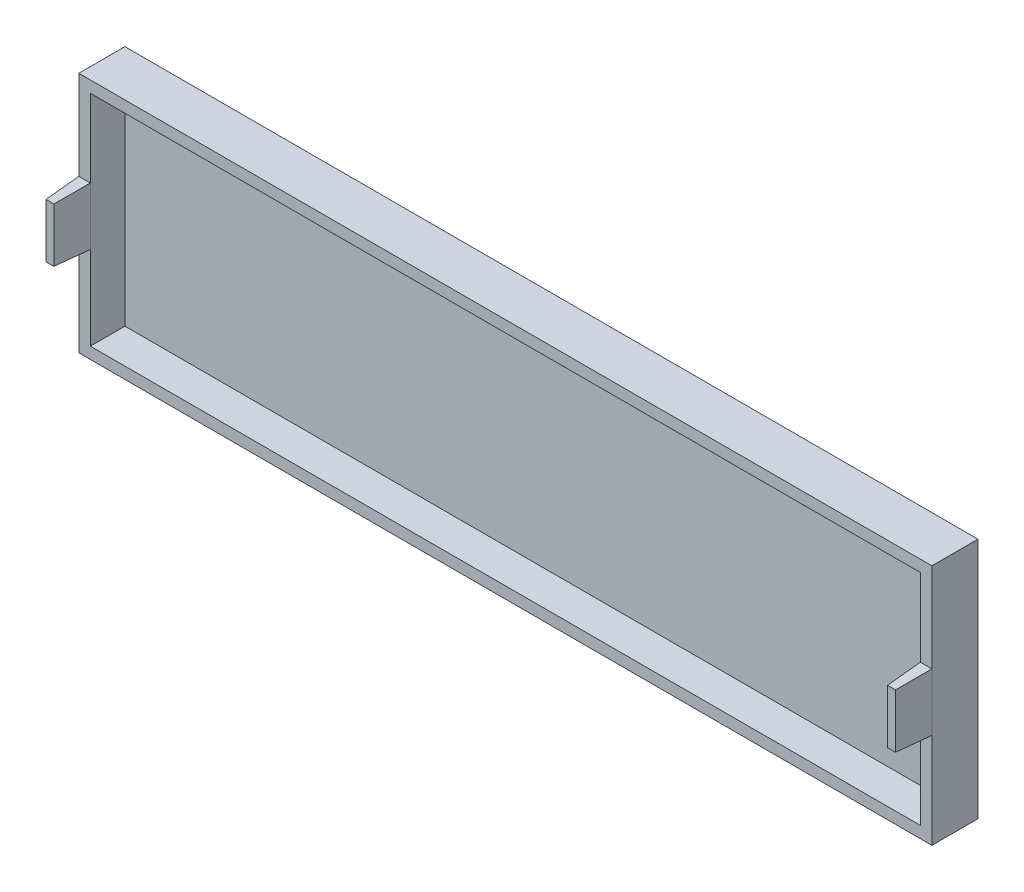
ISO-10303-21;
HEADER;
FILE_DESCRIPTION(('STEP AP214'),'2;1');
FILE_NAME('part.step','',(''),(''),'','','');
FILE_SCHEMA(('AUTOMOTIVE_DESIGN { 1 0 10303 214 1 1 1 1 }'));
ENDSEC;
DATA;
#1=APPLICATION_CONTEXT('core data for automotive mechanical design processes');
#2=APPLICATION_PROTOCOL_DEFINITION('international standard','automotive_design',2000,#1);
#3=PRODUCT_CONTEXT('',#1,'mechanical');
#4=PRODUCT('Part','Part','',(#3));
#5=PRODUCT_RELATED_PRODUCT_CATEGORY('part','',(#4));
#6=PRODUCT_DEFINITION_FORMATION('','',#4);
#7=PRODUCT_DEFINITION_CONTEXT('part definition',#1,'design');
#8=PRODUCT_DEFINITION('design','',#6,#7);
#9=PRODUCT_DEFINITION_SHAPE('','',#8);
#10=(LENGTH_UNIT() NAMED_UNIT(*) SI_UNIT(.MILLI.,.METRE.));
#11=(NAMED_UNIT(*) PLANE_ANGLE_UNIT() SI_UNIT($,.RADIAN.));
#12=(NAMED_UNIT(*) SI_UNIT($,.STERADIAN.) SOLID_ANGLE_UNIT());
#13=UNCERTAINTY_MEASURE_WITH_UNIT(LENGTH_MEASURE(1.E-05),#10,'distance_accuracy_value','');
#14=(GEOMETRIC_REPRESENTATION_CONTEXT(3) GLOBAL_UNCERTAINTY_ASSIGNED_CONTEXT((#13)) GLOBAL_UNIT_ASSIGNED_CONTEXT((#10,
#11,#12)) REPRESENTATION_CONTEXT('',''));
#15=CARTESIAN_POINT('',(0.,0.,0.));
#16=DIRECTION('',(0.,0.,1.));
#17=DIRECTION('',(1.,0.,0.));
#18=AXIS2_PLACEMENT_3D('',#15,#16,#17);
#19=CARTESIAN_POINT('',(0.,0.,8.));
#20=DIRECTION('',(0.,0.,1.));
#21=DIRECTION('',(1.,0.,0.));
#22=AXIS2_PLACEMENT_3D('',#19,#20,#21);
#23=PLANE('',#22);
#24=DIRECTION('',(1.,0.,0.));
#25=VECTOR('',#24,1.);
#26=CARTESIAN_POINT('',(74.,5.51539286145829,8.));
#27=LINE('',#26,#25);
#28=CARTESIAN_POINT('',(72.,5.51539286145829,8.));
#29=VERTEX_POINT('',#28);
#30=CARTESIAN_POINT('',(74.,5.51539286145829,8.));
#31=VERTEX_POINT('',#30);
#32=EDGE_CURVE('E49',#29,#31,#27,.T.);
#33=ORIENTED_EDGE('',*,*,#32,.T.);
#34=DIRECTION('',(0.,1.,0.));
#35=VECTOR('',#34,1.);
#36=CARTESIAN_POINT('',(74.,-21.,8.));
#37=LINE('',#36,#35);
#38=CARTESIAN_POINT('',(74.,21.,8.));
#39=VERTEX_POINT('',#38);
#40=EDGE_CURVE('E226',#31,#39,#37,.T.);
#41=ORIENTED_EDGE('',*,*,#40,.T.);
#42=DIRECTION('',(-1.,0.,0.));
#43=VECTOR('',#42,1.);
#44=CARTESIAN_POINT('',(74.,21.,8.));
#45=LINE('',#44,#43);
#46=CARTESIAN_POINT('',(-74.,21.,8.));
#47=VERTEX_POINT('',#46);
#48=EDGE_CURVE('E218',#39,#47,#45,.T.);
#49=ORIENTED_EDGE('',*,*,#48,.T.);
#50=DIRECTION('',(0.,-1.,0.));
#51=VECTOR('',#50,1.);
#52=CARTESIAN_POINT('',(-74.,21.,8.));
#53=LINE('',#52,#51);
#54=CARTESIAN_POINT('',(-74.,5.5153928614583,8.));
#55=VERTEX_POINT('',#54);
#56=EDGE_CURVE('E222',#47,#55,#53,.T.);
#57=ORIENTED_EDGE('',*,*,#56,.T.);
#58=DIRECTION('',(-1.,0.,0.));
#59=VECTOR('',#58,1.);
#60=CARTESIAN_POINT('',(-74.,5.51539286145829,8.));
#61=LINE('',#60,#59);
#62=CARTESIAN_POINT('',(-72.,5.51539286145829,8.));
#63=VERTEX_POINT('',#62);
#64=EDGE_CURVE('E57',#63,#55,#61,.T.);
#65=ORIENTED_EDGE('',*,*,#64,.F.);
#66=DIRECTION('',(0.,-1.,0.));
#67=VECTOR('',#66,1.);
#68=CARTESIAN_POINT('',(-72.,19.,8.));
#69=LINE('',#68,#67);
#70=CARTESIAN_POINT('',(-72.,19.,8.));
#71=VERTEX_POINT('',#70);
#72=EDGE_CURVE('E196',#71,#63,#69,.T.);
#73=ORIENTED_EDGE('',*,*,#72,.F.);
#74=DIRECTION('',(-1.,0.,0.));
#75=VECTOR('',#74,1.);
#76=CARTESIAN_POINT('',(72.,19.,8.));
#77=LINE('',#76,#75);
#78=CARTESIAN_POINT('',(72.,19.,8.));
#79=VERTEX_POINT('',#78);
#80=EDGE_CURVE('E186',#79,#71,#77,.T.);
#81=ORIENTED_EDGE('',*,*,#80,.F.);
#82=DIRECTION('',(0.,1.,0.));
#83=VECTOR('',#82,1.);
#84=CARTESIAN_POINT('',(72.,-19.,8.));
#85=LINE('',#84,#83);
#86=EDGE_CURVE('E187',#29,#79,#85,.T.);
#87=ORIENTED_EDGE('',*,*,#86,.F.);
#88=EDGE_LOOP('',(#33,#41,#49,#57,#65,#73,#81,#87));
#89=FACE_BOUND('',#88,.T.);
#90=ADVANCED_FACE('F34',(#89),#23,.T.);
#91=CARTESIAN_POINT('',(-74.,-21.,2.));
#92=DIRECTION('',(1.,0.,0.));
#93=DIRECTION('',(0.,0.,-1.));
#94=AXIS2_PLACEMENT_3D('',#91,#92,#93);
#95=PLANE('',#94);
#96=DIRECTION('',(0.,-1.,0.));
#97=VECTOR('',#96,1.);
#98=CARTESIAN_POINT('',(-74.,-21.,0.));
#99=LINE('',#98,#97);
#100=CARTESIAN_POINT('',(-74.,21.,0.));
#101=VERTEX_POINT('',#100);
#102=CARTESIAN_POINT('',(-74.,-21.,0.));
#103=VERTEX_POINT('',#102);
#104=EDGE_CURVE('E228',#101,#103,#99,.T.);
#105=ORIENTED_EDGE('',*,*,#104,.T.);
#106=DIRECTION('',(0.,0.,-1.));
#107=VECTOR('',#106,1.);
#108=CARTESIAN_POINT('',(-74.,-21.,2.));
#109=LINE('',#108,#107);
#110=CARTESIAN_POINT('',(-74.,-21.,8.));
#111=VERTEX_POINT('',#110);
#112=EDGE_CURVE('E11',#111,#103,#109,.T.);
#113=ORIENTED_EDGE('',*,*,#112,.F.);
#114=CARTESIAN_POINT('',(-74.,-4.4846071385417,8.));
#115=VERTEX_POINT('',#114);
#116=EDGE_CURVE('E221',#115,#111,#53,.T.);
#117=ORIENTED_EDGE('',*,*,#116,.F.);
#118=DIRECTION('',(0.,-1.,0.));
#119=VECTOR('',#118,1.);
#120=CARTESIAN_POINT('',(-74.,-4.48460713854171,8.));
#121=LINE('',#120,#119);
#122=EDGE_CURVE('E261',#55,#115,#121,.T.);
#123=ORIENTED_EDGE('',*,*,#122,.F.);
#124=ORIENTED_EDGE('',*,*,#56,.F.);
#125=DIRECTION('',(0.,0.,-1.));
#126=VECTOR('',#125,1.);
#127=CARTESIAN_POINT('',(-74.,21.,2.));
#128=LINE('',#127,#126);
#129=EDGE_CURVE('E237',#47,#101,#128,.T.);
#130=ORIENTED_EDGE('',*,*,#129,.T.);
#131=EDGE_LOOP('',(#105,#113,#117,#123,#124,#130));
#132=FACE_BOUND('',#131,.T.);
#133=ADVANCED_FACE('F36',(#132),#95,.F.);
#134=CARTESIAN_POINT('',(74.,-21.,2.));
#135=DIRECTION('',(0.,1.,0.));
#136=DIRECTION('',(-1.,0.,0.));
#137=AXIS2_PLACEMENT_3D('',#134,#135,#136);
#138=PLANE('',#137);
#139=DIRECTION('',(1.,0.,0.));
#140=VECTOR('',#139,1.);
#141=CARTESIAN_POINT('',(74.,-21.,0.));
#142=LINE('',#141,#140);
#143=CARTESIAN_POINT('',(74.,-21.,0.));
#144=VERTEX_POINT('',#143);
#145=EDGE_CURVE('E231',#103,#144,#142,.T.);
#146=ORIENTED_EDGE('',*,*,#145,.T.);
#147=DIRECTION('',(0.,0.,-1.));
#148=VECTOR('',#147,1.);
#149=CARTESIAN_POINT('',(74.,-21.,2.));
#150=LINE('',#149,#148);
#151=CARTESIAN_POINT('',(74.,-21.,8.));
#152=VERTEX_POINT('',#151);
#153=EDGE_CURVE('E42',#152,#144,#150,.T.);
#154=ORIENTED_EDGE('',*,*,#153,.F.);
#155=DIRECTION('',(1.,0.,0.));
#156=VECTOR('',#155,1.);
#157=CARTESIAN_POINT('',(-74.,-21.,8.));
#158=LINE('',#157,#156);
#159=EDGE_CURVE('E224',#111,#152,#158,.T.);
#160=ORIENTED_EDGE('',*,*,#159,.F.);
#161=ORIENTED_EDGE('',*,*,#112,.T.);
#162=EDGE_LOOP('',(#146,#154,#160,#161));
#163=FACE_BOUND('',#162,.T.);
#164=ADVANCED_FACE('F322',(#163),#138,.F.);
#165=CARTESIAN_POINT('',(74.,-21.,2.));
#166=DIRECTION('',(-1.,0.,0.));
#167=DIRECTION('',(0.,0.,1.));
#168=AXIS2_PLACEMENT_3D('',#165,#166,#167);
#169=PLANE('',#168);
#170=DIRECTION('',(0.,1.,0.));
#171=VECTOR('',#170,1.);
#172=CARTESIAN_POINT('',(74.,-21.,0.));
#173=LINE('',#172,#171);
#174=CARTESIAN_POINT('',(74.,21.,0.));
#175=VERTEX_POINT('',#174);
#176=EDGE_CURVE('E233',#144,#175,#173,.T.);
#177=ORIENTED_EDGE('',*,*,#176,.T.);
#178=DIRECTION('',(0.,0.,-1.));
#179=VECTOR('',#178,1.);
#180=CARTESIAN_POINT('',(74.,21.,2.));
#181=LINE('',#180,#179);
#182=EDGE_CURVE('E240',#39,#175,#181,.T.);
#183=ORIENTED_EDGE('',*,*,#182,.F.);
#184=ORIENTED_EDGE('',*,*,#40,.F.);
#185=DIRECTION('',(0.,-1.,0.));
#186=VECTOR('',#185,1.);
#187=CARTESIAN_POINT('',(74.,-4.48460713854171,8.));
#188=LINE('',#187,#186);
#189=CARTESIAN_POINT('',(74.,-4.48460713854171,8.));
#190=VERTEX_POINT('',#189);
#191=EDGE_CURVE('E179',#31,#190,#188,.T.);
#192=ORIENTED_EDGE('',*,*,#191,.T.);
#193=EDGE_CURVE('E178',#152,#190,#37,.T.);
#194=ORIENTED_EDGE('',*,*,#193,.F.);
#195=ORIENTED_EDGE('',*,*,#153,.T.);
#196=EDGE_LOOP('',(#177,#183,#184,#192,#194,#195));
#197=FACE_BOUND('',#196,.T.);
#198=ADVANCED_FACE('F245',(#197),#169,.F.);
#199=CARTESIAN_POINT('',(74.,21.,2.));
#200=DIRECTION('',(0.,-1.,0.));
#201=DIRECTION('',(1.,0.,0.));
#202=AXIS2_PLACEMENT_3D('',#199,#200,#201);
#203=PLANE('',#202);
#204=DIRECTION('',(-1.,0.,0.));
#205=VECTOR('',#204,1.);
#206=CARTESIAN_POINT('',(74.,21.,0.));
#207=LINE('',#206,#205);
#208=EDGE_CURVE('E235',#175,#101,#207,.T.);
#209=ORIENTED_EDGE('',*,*,#208,.T.);
#210=ORIENTED_EDGE('',*,*,#129,.F.);
#211=ORIENTED_EDGE('',*,*,#48,.F.);
#212=ORIENTED_EDGE('',*,*,#182,.T.);
#213=EDGE_LOOP('',(#209,#210,#211,#212));
#214=FACE_BOUND('',#213,.T.);
#215=ADVANCED_FACE('F254',(#214),#203,.F.);
#216=CARTESIAN_POINT('',(0.,0.,0.));
#217=DIRECTION('',(0.,0.,1.));
#218=DIRECTION('',(1.,0.,0.));
#219=AXIS2_PLACEMENT_3D('',#216,#217,#218);
#220=PLANE('',#219);
#221=ORIENTED_EDGE('',*,*,#104,.F.);
#222=ORIENTED_EDGE('',*,*,#208,.F.);
#223=ORIENTED_EDGE('',*,*,#176,.F.);
#224=ORIENTED_EDGE('',*,*,#145,.F.);
#225=EDGE_LOOP('',(#221,#222,#223,#224));
#226=FACE_BOUND('',#225,.T.);
#227=ADVANCED_FACE('F252',(#226),#220,.F.);
#228=DIRECTION('',(-1.,0.,0.));
#229=VECTOR('',#228,1.);
#230=CARTESIAN_POINT('',(72.,-4.48460713854171,8.));
#231=LINE('',#230,#229);
#232=CARTESIAN_POINT('',(72.,-4.48460713854171,8.));
#233=VERTEX_POINT('',#232);
#234=EDGE_CURVE('E153',#190,#233,#231,.T.);
#235=ORIENTED_EDGE('',*,*,#234,.T.);
#236=CARTESIAN_POINT('',(72.,-19.,8.));
#237=VERTEX_POINT('',#236);
#238=EDGE_CURVE('E175',#237,#233,#85,.T.);
#239=ORIENTED_EDGE('',*,*,#238,.F.);
#240=DIRECTION('',(1.,0.,0.));
#241=VECTOR('',#240,1.);
#242=CARTESIAN_POINT('',(-72.,-19.,8.));
#243=LINE('',#242,#241);
#244=CARTESIAN_POINT('',(-72.,-19.,8.));
#245=VERTEX_POINT('',#244);
#246=EDGE_CURVE('E198',#245,#237,#243,.T.);
#247=ORIENTED_EDGE('',*,*,#246,.F.);
#248=CARTESIAN_POINT('',(-72.,-4.48460713854171,8.));
#249=VERTEX_POINT('',#248);
#250=EDGE_CURVE('E189',#249,#245,#69,.T.);
#251=ORIENTED_EDGE('',*,*,#250,.F.);
#252=DIRECTION('',(1.,0.,0.));
#253=VECTOR('',#252,1.);
#254=CARTESIAN_POINT('',(-72.,-4.48460713854171,8.));
#255=LINE('',#254,#253);
#256=EDGE_CURVE('E283',#115,#249,#255,.T.);
#257=ORIENTED_EDGE('',*,*,#256,.F.);
#258=ORIENTED_EDGE('',*,*,#116,.T.);
#259=ORIENTED_EDGE('',*,*,#159,.T.);
#260=ORIENTED_EDGE('',*,*,#193,.T.);
#261=EDGE_LOOP('',(#235,#239,#247,#251,#257,#258,#259,#260));
#262=FACE_BOUND('',#261,.T.);
#263=ADVANCED_FACE('F173',(#262),#23,.T.);
#264=CARTESIAN_POINT('',(72.,-19.,8.));
#265=DIRECTION('',(-1.,0.,0.));
#266=DIRECTION('',(0.,0.,1.));
#267=AXIS2_PLACEMENT_3D('',#264,#265,#266);
#268=PLANE('',#267);
#269=DIRECTION('',(0.,1.,0.));
#270=VECTOR('',#269,1.);
#271=CARTESIAN_POINT('',(72.,-19.,2.));
#272=LINE('',#271,#270);
#273=CARTESIAN_POINT('',(72.,-19.,2.));
#274=VERTEX_POINT('',#273);
#275=CARTESIAN_POINT('',(72.,19.,2.));
#276=VERTEX_POINT('',#275);
#277=EDGE_CURVE('E200',#274,#276,#272,.T.);
#278=ORIENTED_EDGE('',*,*,#277,.F.);
#279=DIRECTION('',(0.,0.,-1.));
#280=VECTOR('',#279,1.);
#281=CARTESIAN_POINT('',(72.,-19.,8.));
#282=LINE('',#281,#280);
#283=EDGE_CURVE('E185',#237,#274,#282,.T.);
#284=ORIENTED_EDGE('',*,*,#283,.F.);
#285=ORIENTED_EDGE('',*,*,#238,.T.);
#286=DIRECTION('',(0.,1.,0.));
#287=VECTOR('',#286,1.);
#288=CARTESIAN_POINT('',(72.,5.51539286145829,8.));
#289=LINE('',#288,#287);
#290=EDGE_CURVE('E164',#233,#29,#289,.T.);
#291=ORIENTED_EDGE('',*,*,#290,.T.);
#292=ORIENTED_EDGE('',*,*,#86,.T.);
#293=DIRECTION('',(0.,0.,-1.));
#294=VECTOR('',#293,1.);
#295=CARTESIAN_POINT('',(72.,19.,8.));
#296=LINE('',#295,#294);
#297=EDGE_CURVE('E215',#79,#276,#296,.T.);
#298=ORIENTED_EDGE('',*,*,#297,.T.);
#299=EDGE_LOOP('',(#278,#284,#285,#291,#292,#298));
#300=FACE_BOUND('',#299,.T.);
#301=ADVANCED_FACE('F183',(#300),#268,.T.);
#302=CARTESIAN_POINT('',(72.,19.,8.));
#303=DIRECTION('',(0.,-1.,0.));
#304=DIRECTION('',(0.,0.,-1.));
#305=AXIS2_PLACEMENT_3D('',#302,#303,#304);
#306=PLANE('',#305);
#307=DIRECTION('',(-1.,0.,0.));
#308=VECTOR('',#307,1.);
#309=CARTESIAN_POINT('',(72.,19.,2.));
#310=LINE('',#309,#308);
#311=CARTESIAN_POINT('',(-72.,19.,2.));
#312=VERTEX_POINT('',#311);
#313=EDGE_CURVE('E202',#276,#312,#310,.T.);
#314=ORIENTED_EDGE('',*,*,#313,.F.);
#315=ORIENTED_EDGE('',*,*,#297,.F.);
#316=ORIENTED_EDGE('',*,*,#80,.T.);
#317=DIRECTION('',(0.,0.,-1.));
#318=VECTOR('',#317,1.);
#319=CARTESIAN_POINT('',(-72.,19.,8.));
#320=LINE('',#319,#318);
#321=EDGE_CURVE('E212',#71,#312,#320,.T.);
#322=ORIENTED_EDGE('',*,*,#321,.T.);
#323=EDGE_LOOP('',(#314,#315,#316,#322));
#324=FACE_BOUND('',#323,.T.);
#325=ADVANCED_FACE('F340',(#324),#306,.T.);
#326=CARTESIAN_POINT('',(-72.,19.,8.));
#327=DIRECTION('',(1.,0.,0.));
#328=DIRECTION('',(0.,0.,-1.));
#329=AXIS2_PLACEMENT_3D('',#326,#327,#328);
#330=PLANE('',#329);
#331=DIRECTION('',(0.,-1.,0.));
#332=VECTOR('',#331,1.);
#333=CARTESIAN_POINT('',(-72.,19.,2.));
#334=LINE('',#333,#332);
#335=CARTESIAN_POINT('',(-72.,-19.,2.));
#336=VERTEX_POINT('',#335);
#337=EDGE_CURVE('E205',#312,#336,#334,.T.);
#338=ORIENTED_EDGE('',*,*,#337,.F.);
#339=ORIENTED_EDGE('',*,*,#321,.F.);
#340=ORIENTED_EDGE('',*,*,#72,.T.);
#341=DIRECTION('',(0.,1.,0.));
#342=VECTOR('',#341,1.);
#343=CARTESIAN_POINT('',(-72.,5.51539286145829,8.));
#344=LINE('',#343,#342);
#345=EDGE_CURVE('E286',#249,#63,#344,.T.);
#346=ORIENTED_EDGE('',*,*,#345,.F.);
#347=ORIENTED_EDGE('',*,*,#250,.T.);
#348=DIRECTION('',(0.,0.,-1.));
#349=VECTOR('',#348,1.);
#350=CARTESIAN_POINT('',(-72.,-19.,8.));
#351=LINE('',#350,#349);
#352=EDGE_CURVE('E209',#245,#336,#351,.T.);
#353=ORIENTED_EDGE('',*,*,#352,.T.);
#354=EDGE_LOOP('',(#338,#339,#340,#346,#347,#353));
#355=FACE_BOUND('',#354,.T.);
#356=ADVANCED_FACE('F355',(#355),#330,.T.);
#357=CARTESIAN_POINT('',(-72.,-19.,8.));
#358=DIRECTION('',(0.,1.,0.));
#359=DIRECTION('',(0.,0.,1.));
#360=AXIS2_PLACEMENT_3D('',#357,#358,#359);
#361=PLANE('',#360);
#362=DIRECTION('',(1.,0.,0.));
#363=VECTOR('',#362,1.);
#364=CARTESIAN_POINT('',(-72.,-19.,2.));
#365=LINE('',#364,#363);
#366=EDGE_CURVE('E191',#336,#274,#365,.T.);
#367=ORIENTED_EDGE('',*,*,#366,.F.);
#368=ORIENTED_EDGE('',*,*,#352,.F.);
#369=ORIENTED_EDGE('',*,*,#246,.T.);
#370=ORIENTED_EDGE('',*,*,#283,.T.);
#371=EDGE_LOOP('',(#367,#368,#369,#370));
#372=FACE_BOUND('',#371,.T.);
#373=ADVANCED_FACE('F348',(#372),#361,.T.);
#374=CARTESIAN_POINT('',(0.,0.,2.));
#375=DIRECTION('',(0.,0.,1.));
#376=DIRECTION('',(1.,0.,0.));
#377=AXIS2_PLACEMENT_3D('',#374,#375,#376);
#378=PLANE('',#377);
#379=ORIENTED_EDGE('',*,*,#277,.T.);
#380=ORIENTED_EDGE('',*,*,#313,.T.);
#381=ORIENTED_EDGE('',*,*,#337,.T.);
#382=ORIENTED_EDGE('',*,*,#366,.T.);
#383=EDGE_LOOP('',(#379,#380,#381,#382));
#384=FACE_BOUND('',#383,.T.);
#385=ADVANCED_FACE('F346',(#384),#378,.T.);
#386=CARTESIAN_POINT('',(-74.,5.51539286145829,8.));
#387=DIRECTION('',(0.,0.998629534754574,0.0523359562429439));
#388=DIRECTION('',(0.,-0.0523359562429439,0.998629534754574));
#389=AXIS2_PLACEMENT_3D('',#386,#387,#388);
#390=PLANE('',#389);
#391=ORIENTED_EDGE('',*,*,#64,.T.);
#392=DIRECTION('',(-0.052264427688714,0.052264427688714,-0.997264688634237));
#393=VECTOR('',#392,1.);
#394=CARTESIAN_POINT('',(-73.9726842959837,5.488077157442,8.52121468205632));
#395=LINE('',#394,#393);
#396=CARTESIAN_POINT('',(-73.6855533243018,5.20094618576005,14.));
#397=VERTEX_POINT('',#396);
#398=EDGE_CURVE('E203',#397,#55,#395,.T.);
#399=ORIENTED_EDGE('',*,*,#398,.F.);
#400=DIRECTION('',(1.,0.,0.));
#401=VECTOR('',#400,1.);
#402=CARTESIAN_POINT('',(0.,5.20094618576005,14.));
#403=LINE('',#402,#401);
#404=CARTESIAN_POINT('',(-72.3144466756982,5.20094618576005,14.));
#405=VERTEX_POINT('',#404);
#406=EDGE_CURVE('E289',#405,#397,#403,.F.);
#407=ORIENTED_EDGE('',*,*,#406,.F.);
#408=DIRECTION('',(0.052264427688714,0.052264427688714,-0.997264688634237));
#409=VECTOR('',#408,1.);
#410=CARTESIAN_POINT('',(-72.0054631408032,5.50992972065504,8.10424293641126));
#411=LINE('',#410,#409);
#412=EDGE_CURVE('E292',#405,#63,#411,.T.);
#413=ORIENTED_EDGE('',*,*,#412,.T.);
#414=EDGE_LOOP('',(#391,#399,#407,#413));
#415=FACE_BOUND('',#414,.T.);
#416=ADVANCED_FACE('F315',(#415),#390,.T.);
#417=CARTESIAN_POINT('',(-74.,-4.48460713854171,8.));
#418=DIRECTION('',(-0.998629534754574,0.,0.0523359562429439));
#419=DIRECTION('',(0.0523359562429439,0.,0.998629534754574));
#420=AXIS2_PLACEMENT_3D('',#417,#418,#419);
#421=PLANE('',#420);
#422=ORIENTED_EDGE('',*,*,#122,.T.);
#423=DIRECTION('',(-0.052264427688714,-0.0522644276887139,-0.997264688634237));
#424=VECTOR('',#423,1.);
#425=CARTESIAN_POINT('',(-73.9945368591967,-4.47914399773845,8.10424293641126));
#426=LINE('',#425,#424);
#427=CARTESIAN_POINT('',(-73.6855533243018,-4.17016046284346,14.));
#428=VERTEX_POINT('',#427);
#429=EDGE_CURVE('E291',#428,#115,#426,.T.);
#430=ORIENTED_EDGE('',*,*,#429,.F.);
#431=DIRECTION('',(0.,1.,0.));
#432=VECTOR('',#431,1.);
#433=CARTESIAN_POINT('',(-73.6855533243017,0.,14.));
#434=LINE('',#433,#432);
#435=EDGE_CURVE('E302',#397,#428,#434,.F.);
#436=ORIENTED_EDGE('',*,*,#435,.F.);
#437=ORIENTED_EDGE('',*,*,#398,.T.);
#438=EDGE_LOOP('',(#422,#430,#436,#437));
#439=FACE_BOUND('',#438,.T.);
#440=ADVANCED_FACE('F317',(#439),#421,.T.);
#441=CARTESIAN_POINT('',(-72.,-4.48460713854171,8.));
#442=DIRECTION('',(0.,-0.998629534754574,0.0523359562429439));
#443=DIRECTION('',(0.,-0.0523359562429439,-0.998629534754574));
#444=AXIS2_PLACEMENT_3D('',#441,#442,#443);
#445=PLANE('',#444);
#446=ORIENTED_EDGE('',*,*,#256,.T.);
#447=DIRECTION('',(0.052264427688714,-0.052264427688714,-0.997264688634237));
#448=VECTOR('',#447,1.);
#449=CARTESIAN_POINT('',(-72.0273157040163,-4.45729143452542,8.52121468205632));
#450=LINE('',#449,#448);
#451=CARTESIAN_POINT('',(-72.3144466756982,-4.17016046284346,14.));
#452=VERTEX_POINT('',#451);
#453=EDGE_CURVE('E295',#452,#249,#450,.T.);
#454=ORIENTED_EDGE('',*,*,#453,.F.);
#455=DIRECTION('',(-1.,0.,0.));
#456=VECTOR('',#455,1.);
#457=CARTESIAN_POINT('',(0.,-4.17016046284349,14.));
#458=LINE('',#457,#456);
#459=EDGE_CURVE('E303',#428,#452,#458,.F.);
#460=ORIENTED_EDGE('',*,*,#459,.F.);
#461=ORIENTED_EDGE('',*,*,#429,.T.);
#462=EDGE_LOOP('',(#446,#454,#460,#461));
#463=FACE_BOUND('',#462,.T.);
#464=ADVANCED_FACE('F320',(#463),#445,.T.);
#465=CARTESIAN_POINT('',(-72.,5.51539286145829,8.));
#466=DIRECTION('',(0.998629534754574,0.,0.0523359562429439));
#467=DIRECTION('',(0.0523359562429439,0.,-0.998629534754574));
#468=AXIS2_PLACEMENT_3D('',#465,#466,#467);
#469=PLANE('',#468);
#470=ORIENTED_EDGE('',*,*,#345,.T.);
#471=ORIENTED_EDGE('',*,*,#412,.F.);
#472=DIRECTION('',(0.,-1.,0.));
#473=VECTOR('',#472,1.);
#474=CARTESIAN_POINT('',(-72.3144466756982,0.,14.));
#475=LINE('',#474,#473);
#476=EDGE_CURVE('E193',#452,#405,#475,.F.);
#477=ORIENTED_EDGE('',*,*,#476,.F.);
#478=ORIENTED_EDGE('',*,*,#453,.T.);
#479=EDGE_LOOP('',(#470,#471,#477,#478));
#480=FACE_BOUND('',#479,.T.);
#481=ADVANCED_FACE('F313',(#480),#469,.T.);
#482=CARTESIAN_POINT('',(0.,0.,14.));
#483=DIRECTION('',(0.,0.,-1.));
#484=DIRECTION('',(-1.,0.,0.));
#485=AXIS2_PLACEMENT_3D('',#482,#483,#484);
#486=PLANE('',#485);
#487=ORIENTED_EDGE('',*,*,#406,.T.);
#488=ORIENTED_EDGE('',*,*,#435,.T.);
#489=ORIENTED_EDGE('',*,*,#459,.T.);
#490=ORIENTED_EDGE('',*,*,#476,.T.);
#491=EDGE_LOOP('',(#487,#488,#489,#490));
#492=FACE_BOUND('',#491,.T.);
#493=ADVANCED_FACE('F309',(#492),#486,.F.);
#494=CARTESIAN_POINT('',(74.,5.51539286145829,8.));
#495=DIRECTION('',(0.,0.998629534754574,0.0523359562429439));
#496=DIRECTION('',(0.,-0.0523359562429439,0.998629534754574));
#497=AXIS2_PLACEMENT_3D('',#494,#495,#496);
#498=PLANE('',#497);
#499=ORIENTED_EDGE('',*,*,#32,.F.);
#500=DIRECTION('',(-0.052264427688714,0.052264427688714,-0.997264688634237));
#501=VECTOR('',#500,1.);
#502=CARTESIAN_POINT('',(72.,5.51539286145829,8.));
#503=LINE('',#502,#501);
#504=CARTESIAN_POINT('',(72.3144466756982,5.20094618576005,14.));
#505=VERTEX_POINT('',#504);
#506=EDGE_CURVE('E160',#505,#29,#503,.T.);
#507=ORIENTED_EDGE('',*,*,#506,.F.);
#508=DIRECTION('',(1.,0.,0.));
#509=VECTOR('',#508,1.);
#510=CARTESIAN_POINT('',(0.,5.20094618576005,14.));
#511=LINE('',#510,#509);
#512=CARTESIAN_POINT('',(73.6855533243018,5.20094618576005,14.));
#513=VERTEX_POINT('',#512);
#514=EDGE_CURVE('E266',#505,#513,#511,.T.);
#515=ORIENTED_EDGE('',*,*,#514,.T.);
#516=DIRECTION('',(0.052264427688714,0.052264427688714,-0.997264688634237));
#517=VECTOR('',#516,1.);
#518=CARTESIAN_POINT('',(74.,5.51539286145829,8.));
#519=LINE('',#518,#517);
#520=EDGE_CURVE('E273',#513,#31,#519,.T.);
#521=ORIENTED_EDGE('',*,*,#520,.T.);
#522=EDGE_LOOP('',(#499,#507,#515,#521));
#523=FACE_BOUND('',#522,.T.);
#524=ADVANCED_FACE('F382',(#523),#498,.T.);
#525=CARTESIAN_POINT('',(72.,5.51539286145829,8.));
#526=DIRECTION('',(-0.998629534754574,0.,0.0523359562429439));
#527=DIRECTION('',(0.0523359562429439,0.,0.998629534754574));
#528=AXIS2_PLACEMENT_3D('',#525,#526,#527);
#529=PLANE('',#528);
#530=ORIENTED_EDGE('',*,*,#290,.F.);
#531=DIRECTION('',(-0.052264427688714,-0.052264427688714,-0.997264688634237));
#532=VECTOR('',#531,1.);
#533=CARTESIAN_POINT('',(72.,-4.48460713854171,8.));
#534=LINE('',#533,#532);
#535=CARTESIAN_POINT('',(72.3144466756982,-4.17016046284346,14.));
#536=VERTEX_POINT('',#535);
#537=EDGE_CURVE('E149',#536,#233,#534,.T.);
#538=ORIENTED_EDGE('',*,*,#537,.F.);
#539=DIRECTION('',(0.,1.,0.));
#540=VECTOR('',#539,1.);
#541=CARTESIAN_POINT('',(72.3144466756982,0.,14.));
#542=LINE('',#541,#540);
#543=EDGE_CURVE('E269',#536,#505,#542,.T.);
#544=ORIENTED_EDGE('',*,*,#543,.T.);
#545=ORIENTED_EDGE('',*,*,#506,.T.);
#546=EDGE_LOOP('',(#530,#538,#544,#545));
#547=FACE_BOUND('',#546,.T.);
#548=ADVANCED_FACE('F165',(#547),#529,.T.);
#549=CARTESIAN_POINT('',(72.,-4.48460713854171,8.));
#550=DIRECTION('',(0.,-0.998629534754574,0.0523359562429439));
#551=DIRECTION('',(0.,-0.0523359562429439,-0.998629534754574));
#552=AXIS2_PLACEMENT_3D('',#549,#550,#551);
#553=PLANE('',#552);
#554=ORIENTED_EDGE('',*,*,#234,.F.);
#555=DIRECTION('',(0.052264427688714,-0.0522644276887139,-0.997264688634237));
#556=VECTOR('',#555,1.);
#557=CARTESIAN_POINT('',(74.,-4.48460713854171,8.));
#558=LINE('',#557,#556);
#559=CARTESIAN_POINT('',(73.6855533243018,-4.17016046284346,14.));
#560=VERTEX_POINT('',#559);
#561=EDGE_CURVE('E161',#560,#190,#558,.T.);
#562=ORIENTED_EDGE('',*,*,#561,.F.);
#563=DIRECTION('',(-1.,0.,0.));
#564=VECTOR('',#563,1.);
#565=CARTESIAN_POINT('',(0.,-4.17016046284349,14.));
#566=LINE('',#565,#564);
#567=EDGE_CURVE('E156',#560,#536,#566,.T.);
#568=ORIENTED_EDGE('',*,*,#567,.T.);
#569=ORIENTED_EDGE('',*,*,#537,.T.);
#570=EDGE_LOOP('',(#554,#562,#568,#569));
#571=FACE_BOUND('',#570,.T.);
#572=ADVANCED_FACE('F151',(#571),#553,.T.);
#573=CARTESIAN_POINT('',(74.,-4.48460713854171,8.));
#574=DIRECTION('',(0.998629534754574,0.,0.0523359562429439));
#575=DIRECTION('',(0.0523359562429439,0.,-0.998629534754574));
#576=AXIS2_PLACEMENT_3D('',#573,#574,#575);
#577=PLANE('',#576);
#578=ORIENTED_EDGE('',*,*,#191,.F.);
#579=ORIENTED_EDGE('',*,*,#520,.F.);
#580=DIRECTION('',(0.,-1.,0.));
#581=VECTOR('',#580,1.);
#582=CARTESIAN_POINT('',(73.6855533243017,0.,14.));
#583=LINE('',#582,#581);
#584=EDGE_CURVE('E275',#513,#560,#583,.T.);
#585=ORIENTED_EDGE('',*,*,#584,.T.);
#586=ORIENTED_EDGE('',*,*,#561,.T.);
#587=EDGE_LOOP('',(#578,#579,#585,#586));
#588=FACE_BOUND('',#587,.T.);
#589=ADVANCED_FACE('F387',(#588),#577,.T.);
#590=CARTESIAN_POINT('',(0.,0.,14.));
#591=DIRECTION('',(0.,0.,-1.));
#592=DIRECTION('',(1.,0.,0.));
#593=AXIS2_PLACEMENT_3D('',#590,#591,#592);
#594=PLANE('',#593);
#595=ORIENTED_EDGE('',*,*,#514,.F.);
#596=ORIENTED_EDGE('',*,*,#543,.F.);
#597=ORIENTED_EDGE('',*,*,#567,.F.);
#598=ORIENTED_EDGE('',*,*,#584,.F.);
#599=EDGE_LOOP('',(#595,#596,#597,#598));
#600=FACE_BOUND('',#599,.T.);
#601=ADVANCED_FACE('F390',(#600),#594,.F.);
#602=CLOSED_SHELL('',(#90,#133,#164,#198,#215,#227,#263,#301,#325,#356,#373,#385,#416,#440,#464,
#481,#493,#524,#548,#572,#589,#601));
#603=MANIFOLD_SOLID_BREP('B2',#602);
#604=ADVANCED_BREP_SHAPE_REPRESENTATION('',(#18,#603),#14);
#605=SHAPE_DEFINITION_REPRESENTATION(#9,#604);
ENDSEC;
END-ISO-10303-21;
